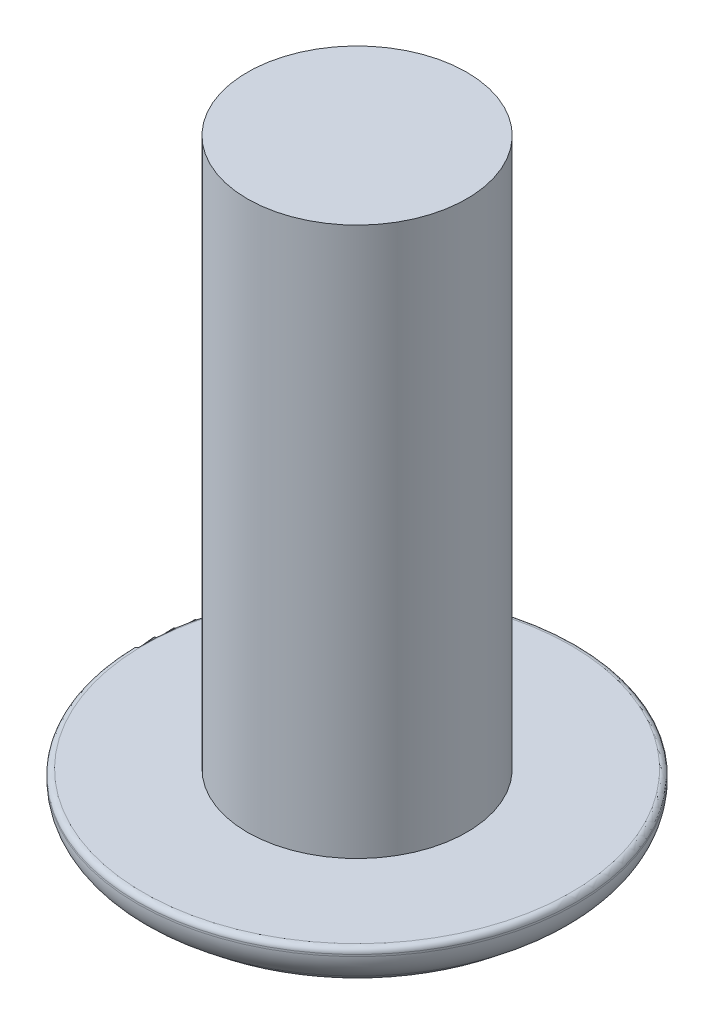
ISO-10303-21;
HEADER;
FILE_DESCRIPTION(('STEP AP214'),'2;1');
FILE_NAME('part.step','',(''),(''),'','','');
FILE_SCHEMA(('AUTOMOTIVE_DESIGN { 1 0 10303 214 1 1 1 1 }'));
ENDSEC;
DATA;
#1=APPLICATION_CONTEXT('core data for automotive mechanical design processes');
#2=APPLICATION_PROTOCOL_DEFINITION('international standard','automotive_design',2000,#1);
#3=PRODUCT_CONTEXT('',#1,'mechanical');
#4=PRODUCT('Part','Part','',(#3));
#5=PRODUCT_RELATED_PRODUCT_CATEGORY('part','',(#4));
#6=PRODUCT_DEFINITION_FORMATION('','',#4);
#7=PRODUCT_DEFINITION_CONTEXT('part definition',#1,'design');
#8=PRODUCT_DEFINITION('design','',#6,#7);
#9=PRODUCT_DEFINITION_SHAPE('','',#8);
#10=(LENGTH_UNIT() NAMED_UNIT(*) SI_UNIT(.MILLI.,.METRE.));
#11=(NAMED_UNIT(*) PLANE_ANGLE_UNIT() SI_UNIT($,.RADIAN.));
#12=(NAMED_UNIT(*) SI_UNIT($,.STERADIAN.) SOLID_ANGLE_UNIT());
#13=UNCERTAINTY_MEASURE_WITH_UNIT(LENGTH_MEASURE(1.E-05),#10,'distance_accuracy_value','');
#14=(GEOMETRIC_REPRESENTATION_CONTEXT(3) GLOBAL_UNCERTAINTY_ASSIGNED_CONTEXT((#13)) GLOBAL_UNIT_ASSIGNED_CONTEXT((#10,
#11,#12)) REPRESENTATION_CONTEXT('',''));
#15=CARTESIAN_POINT('',(0.,0.,0.));
#16=DIRECTION('',(0.,0.,1.));
#17=DIRECTION('',(1.,0.,0.));
#18=AXIS2_PLACEMENT_3D('',#15,#16,#17);
#19=CARTESIAN_POINT('',(0.,50.,0.));
#20=DIRECTION('',(0.,1.,0.));
#21=DIRECTION('',(0.,0.,1.));
#22=AXIS2_PLACEMENT_3D('',#19,#20,#21);
#23=PLANE('',#22);
#24=CARTESIAN_POINT('',(0.,50.,0.));
#25=DIRECTION('',(0.,-1.,0.));
#26=DIRECTION('',(0.,0.,-1.));
#27=AXIS2_PLACEMENT_3D('',#24,#25,#26);
#28=CIRCLE('',#27,10.);
#29=CARTESIAN_POINT('',(0.,50.,-10.));
#30=VERTEX_POINT('',#29);
#31=EDGE_CURVE('E56',#30,#30,#28,.T.);
#32=ORIENTED_EDGE('',*,*,#31,.F.);
#33=EDGE_LOOP('',(#32));
#34=FACE_BOUND('',#33,.T.);
#35=ADVANCED_FACE('F39',(#34),#23,.T.);
#36=CARTESIAN_POINT('',(0.,-34.6211266211266,0.));
#37=DIRECTION('',(0.,-1.,0.));
#38=DIRECTION('',(0.,0.,-1.));
#39=AXIS2_PLACEMENT_3D('',#36,#37,#38);
#40=CYLINDRICAL_SURFACE('',#39,10.);
#41=ORIENTED_EDGE('',*,*,#31,.T.);
#42=EDGE_LOOP('',(#41));
#43=FACE_BOUND('',#42,.T.);
#44=CARTESIAN_POINT('',(0.,0.,0.));
#45=DIRECTION('',(0.,-1.,0.));
#46=DIRECTION('',(0.,0.,-1.));
#47=AXIS2_PLACEMENT_3D('',#44,#45,#46);
#48=CIRCLE('',#47,10.);
#49=CARTESIAN_POINT('',(0.,0.,-10.));
#50=VERTEX_POINT('',#49);
#51=EDGE_CURVE('E65',#50,#50,#48,.T.);
#52=ORIENTED_EDGE('',*,*,#51,.F.);
#53=EDGE_LOOP('',(#52));
#54=FACE_BOUND('',#53,.T.);
#55=ADVANCED_FACE('F70',(#43,#54),#40,.T.);
#56=CARTESIAN_POINT('',(0.,0.,0.));
#57=DIRECTION('',(0.,-1.,0.));
#58=DIRECTION('',(0.,0.,-1.));
#59=AXIS2_PLACEMENT_3D('',#56,#57,#58);
#60=PLANE('',#59);
#61=CARTESIAN_POINT('',(0.,0.,0.));
#62=DIRECTION('',(0.,-1.,0.));
#63=DIRECTION('',(0.,0.,-1.));
#64=AXIS2_PLACEMENT_3D('',#61,#62,#63);
#65=CIRCLE('',#64,19.5);
#66=CARTESIAN_POINT('',(0.,0.,-19.5));
#67=VERTEX_POINT('',#66);
#68=EDGE_CURVE('E10',#67,#67,#65,.F.);
#69=ORIENTED_EDGE('',*,*,#68,.T.);
#70=EDGE_LOOP('',(#69));
#71=FACE_BOUND('',#70,.T.);
#72=ORIENTED_EDGE('',*,*,#51,.T.);
#73=EDGE_LOOP('',(#72));
#74=FACE_BOUND('',#73,.T.);
#75=ADVANCED_FACE('F67',(#71,#74),#60,.F.);
#76=CARTESIAN_POINT('',(0.,-34.6211266211266,0.));
#77=DIRECTION('',(0.,-1.,0.));
#78=DIRECTION('',(0.,0.,-1.));
#79=AXIS2_PLACEMENT_3D('',#76,#77,#78);
#80=CYLINDRICAL_SURFACE('',#79,20.);
#81=CARTESIAN_POINT('',(0.,-0.5,0.));
#82=DIRECTION('',(0.,-1.,0.));
#83=DIRECTION('',(0.,0.,-1.));
#84=AXIS2_PLACEMENT_3D('',#81,#82,#83);
#85=CIRCLE('',#84,20.);
#86=CARTESIAN_POINT('',(0.,-0.5,-20.));
#87=VERTEX_POINT('',#86);
#88=EDGE_CURVE('E46',#87,#87,#85,.T.);
#89=ORIENTED_EDGE('',*,*,#88,.T.);
#90=EDGE_LOOP('',(#89));
#91=FACE_BOUND('',#90,.T.);
#92=CARTESIAN_POINT('',(0.,-0.672315572905993,0.));
#93=DIRECTION('',(0.,1.,0.));
#94=DIRECTION('',(0.,0.,1.));
#95=AXIS2_PLACEMENT_3D('',#92,#93,#94);
#96=CIRCLE('',#95,20.);
#97=CARTESIAN_POINT('',(0.,-0.672315572905993,20.));
#98=VERTEX_POINT('',#97);
#99=EDGE_CURVE('E49',#98,#98,#96,.T.);
#100=ORIENTED_EDGE('',*,*,#99,.T.);
#101=EDGE_LOOP('',(#100));
#102=FACE_BOUND('',#101,.T.);
#103=ADVANCED_FACE('F80',(#91,#102),#80,.T.);
#104=CARTESIAN_POINT('',(0.,19.,0.));
#105=DIRECTION('',(0.,-1.,0.));
#106=DIRECTION('',(0.,0.,1.));
#107=AXIS2_PLACEMENT_3D('',#104,#105,#106);
#108=SPHERICAL_SURFACE('',#107,29.);
#109=CARTESIAN_POINT('',(0.,-2.94219813901053,0.));
#110=DIRECTION('',(0.,1.,0.));
#111=DIRECTION('',(0.,0.,1.));
#112=AXIS2_PLACEMENT_3D('',#109,#110,#111);
#113=CIRCLE('',#112,18.9615384615385);
#114=CARTESIAN_POINT('',(0.,-2.94219813901053,18.9615384615385));
#115=VERTEX_POINT('',#114);
#116=EDGE_CURVE('E53',#115,#115,#113,.F.);
#117=ORIENTED_EDGE('',*,*,#116,.T.);
#118=EDGE_LOOP('',(#117));
#119=FACE_BOUND('',#118,.T.);
#120=ADVANCED_FACE('F81',(#119),#108,.T.);
#121=CARTESIAN_POINT('',(0.,-0.672315572905997,0.));
#122=DIRECTION('',(0.,1.,0.));
#123=DIRECTION('',(0.,0.,1.));
#124=AXIS2_PLACEMENT_3D('',#121,#122,#123);
#125=TOROIDAL_SURFACE('',#124,17.,3.);
#126=ORIENTED_EDGE('',*,*,#99,.F.);
#127=EDGE_LOOP('',(#126));
#128=FACE_BOUND('',#127,.T.);
#129=ORIENTED_EDGE('',*,*,#116,.F.);
#130=EDGE_LOOP('',(#129));
#131=FACE_BOUND('',#130,.T.);
#132=ADVANCED_FACE('F84',(#128,#131),#125,.T.);
#133=CARTESIAN_POINT('',(0.,-0.5,0.));
#134=DIRECTION('',(0.,-1.,0.));
#135=DIRECTION('',(0.,0.,-1.));
#136=AXIS2_PLACEMENT_3D('',#133,#134,#135);
#137=TOROIDAL_SURFACE('',#136,19.5,0.5);
#138=ORIENTED_EDGE('',*,*,#68,.F.);
#139=EDGE_LOOP('',(#138));
#140=FACE_BOUND('',#139,.T.);
#141=ORIENTED_EDGE('',*,*,#88,.F.);
#142=EDGE_LOOP('',(#141));
#143=FACE_BOUND('',#142,.T.);
#144=ADVANCED_FACE('F41',(#140,#143),#137,.T.);
#145=CLOSED_SHELL('',(#35,#55,#75,#103,#120,#132,#144));
#146=MANIFOLD_SOLID_BREP('B2',#145);
#147=ADVANCED_BREP_SHAPE_REPRESENTATION('',(#18,#146),#14);
#148=SHAPE_DEFINITION_REPRESENTATION(#9,#147);
ENDSEC;
END-ISO-10303-21;
